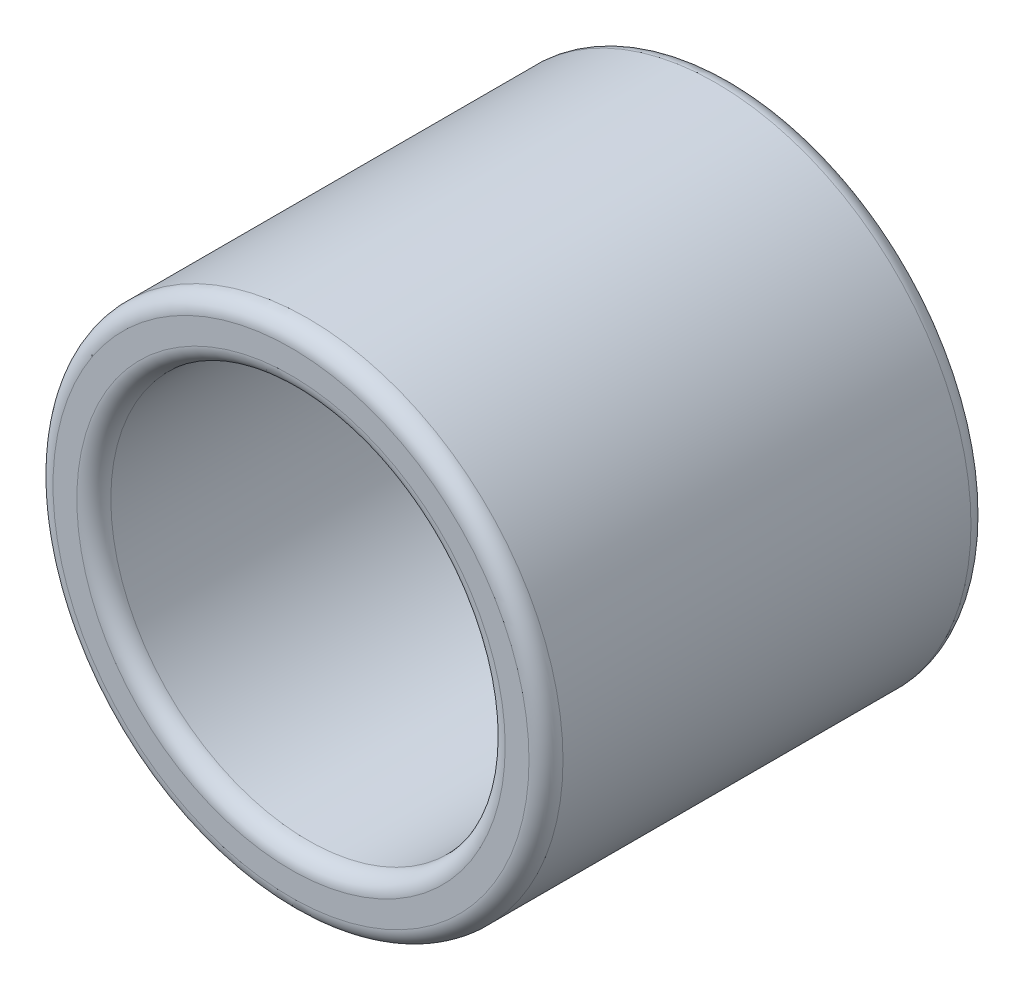
ISO-10303-21;
HEADER;
FILE_DESCRIPTION(('STEP AP214'),'2;1');
FILE_NAME('part.step','',(''),(''),'','','');
FILE_SCHEMA(('AUTOMOTIVE_DESIGN { 1 0 10303 214 1 1 1 1 }'));
ENDSEC;
DATA;
#1=APPLICATION_CONTEXT('core data for automotive mechanical design processes');
#2=APPLICATION_PROTOCOL_DEFINITION('international standard','automotive_design',2000,#1);
#3=PRODUCT_CONTEXT('',#1,'mechanical');
#4=PRODUCT('Part','Part','',(#3));
#5=PRODUCT_RELATED_PRODUCT_CATEGORY('part','',(#4));
#6=PRODUCT_DEFINITION_FORMATION('','',#4);
#7=PRODUCT_DEFINITION_CONTEXT('part definition',#1,'design');
#8=PRODUCT_DEFINITION('design','',#6,#7);
#9=PRODUCT_DEFINITION_SHAPE('','',#8);
#10=(LENGTH_UNIT() NAMED_UNIT(*) SI_UNIT(.MILLI.,.METRE.));
#11=(NAMED_UNIT(*) PLANE_ANGLE_UNIT() SI_UNIT($,.RADIAN.));
#12=(NAMED_UNIT(*) SI_UNIT($,.STERADIAN.) SOLID_ANGLE_UNIT());
#13=UNCERTAINTY_MEASURE_WITH_UNIT(LENGTH_MEASURE(1.E-05),#10,'distance_accuracy_value','');
#14=(GEOMETRIC_REPRESENTATION_CONTEXT(3) GLOBAL_UNCERTAINTY_ASSIGNED_CONTEXT((#13)) GLOBAL_UNIT_ASSIGNED_CONTEXT((#10,
#11,#12)) REPRESENTATION_CONTEXT('',''));
#15=CARTESIAN_POINT('',(0.,0.,0.));
#16=DIRECTION('',(0.,0.,1.));
#17=DIRECTION('',(1.,0.,0.));
#18=AXIS2_PLACEMENT_3D('',#15,#16,#17);
#19=CARTESIAN_POINT('',(0.,0.,13.));
#20=DIRECTION('',(0.,0.,-1.));
#21=DIRECTION('',(-1.,0.,0.));
#22=AXIS2_PLACEMENT_3D('',#19,#20,#21);
#23=CYLINDRICAL_SURFACE('',#22,7.5);
#24=CARTESIAN_POINT('',(0.,0.,0.5));
#25=DIRECTION('',(0.,0.,1.));
#26=DIRECTION('',(1.,0.,0.));
#27=AXIS2_PLACEMENT_3D('',#24,#25,#26);
#28=CIRCLE('',#27,7.5);
#29=CARTESIAN_POINT('',(-7.5,0.,0.5));
#30=VERTEX_POINT('',#29);
#31=EDGE_CURVE('E67',#30,#30,#28,.T.);
#32=CARTESIAN_POINT('',(0.,0.,12.5));
#33=DIRECTION('',(0.,0.,1.));
#34=DIRECTION('',(1.,0.,0.));
#35=AXIS2_PLACEMENT_3D('',#32,#33,#34);
#36=CIRCLE('',#35,7.5);
#37=CARTESIAN_POINT('',(-7.5,0.,12.5));
#38=VERTEX_POINT('',#37);
#39=EDGE_CURVE('E70',#38,#38,#36,.F.);
#40=CARTESIAN_POINT('',(-7.5,0.,0.5));
#41=CARTESIAN_POINT('',(-7.5,0.,0.625000000000001));
#42=CARTESIAN_POINT('',(-7.5,0.,0.750000000000001));
#43=CARTESIAN_POINT('',(-7.5,0.,1.));
#44=CARTESIAN_POINT('',(-7.5,0.,1.125));
#45=CARTESIAN_POINT('',(-7.5,0.,1.375));
#46=CARTESIAN_POINT('',(-7.5,0.,1.5));
#47=CARTESIAN_POINT('',(-7.5,0.,1.75));
#48=CARTESIAN_POINT('',(-7.5,0.,1.875));
#49=CARTESIAN_POINT('',(-7.5,0.,2.125));
#50=CARTESIAN_POINT('',(-7.5,0.,2.25));
#51=CARTESIAN_POINT('',(-7.5,0.,2.5));
#52=CARTESIAN_POINT('',(-7.5,0.,2.625));
#53=CARTESIAN_POINT('',(-7.5,0.,2.875));
#54=CARTESIAN_POINT('',(-7.5,0.,3.));
#55=CARTESIAN_POINT('',(-7.5,0.,3.25));
#56=CARTESIAN_POINT('',(-7.5,0.,3.375));
#57=CARTESIAN_POINT('',(-7.5,0.,3.625));
#58=CARTESIAN_POINT('',(-7.5,0.,3.75));
#59=CARTESIAN_POINT('',(-7.5,0.,4.));
#60=CARTESIAN_POINT('',(-7.5,0.,4.125));
#61=CARTESIAN_POINT('',(-7.5,0.,4.375));
#62=CARTESIAN_POINT('',(-7.5,0.,4.5));
#63=CARTESIAN_POINT('',(-7.5,0.,4.75));
#64=CARTESIAN_POINT('',(-7.5,0.,4.875));
#65=CARTESIAN_POINT('',(-7.5,0.,5.125));
#66=CARTESIAN_POINT('',(-7.5,0.,5.25));
#67=CARTESIAN_POINT('',(-7.5,0.,5.5));
#68=CARTESIAN_POINT('',(-7.5,0.,5.625));
#69=CARTESIAN_POINT('',(-7.5,0.,5.875));
#70=CARTESIAN_POINT('',(-7.5,0.,6.));
#71=CARTESIAN_POINT('',(-7.5,0.,6.25));
#72=CARTESIAN_POINT('',(-7.5,0.,6.375));
#73=CARTESIAN_POINT('',(-7.5,0.,6.625));
#74=CARTESIAN_POINT('',(-7.5,0.,6.75));
#75=CARTESIAN_POINT('',(-7.5,0.,7.));
#76=CARTESIAN_POINT('',(-7.5,0.,7.125));
#77=CARTESIAN_POINT('',(-7.5,0.,7.375));
#78=CARTESIAN_POINT('',(-7.5,0.,7.5));
#79=CARTESIAN_POINT('',(-7.5,0.,7.75));
#80=CARTESIAN_POINT('',(-7.5,0.,7.875));
#81=CARTESIAN_POINT('',(-7.5,0.,8.125));
#82=CARTESIAN_POINT('',(-7.5,0.,8.25));
#83=CARTESIAN_POINT('',(-7.5,0.,8.5));
#84=CARTESIAN_POINT('',(-7.5,0.,8.625));
#85=CARTESIAN_POINT('',(-7.5,0.,8.875));
#86=CARTESIAN_POINT('',(-7.5,0.,9.));
#87=CARTESIAN_POINT('',(-7.5,0.,9.25));
#88=CARTESIAN_POINT('',(-7.5,0.,9.375));
#89=CARTESIAN_POINT('',(-7.5,0.,9.625));
#90=CARTESIAN_POINT('',(-7.5,0.,9.75));
#91=CARTESIAN_POINT('',(-7.5,0.,10.));
#92=CARTESIAN_POINT('',(-7.5,0.,10.125));
#93=CARTESIAN_POINT('',(-7.5,0.,10.375));
#94=CARTESIAN_POINT('',(-7.5,0.,10.5));
#95=CARTESIAN_POINT('',(-7.5,0.,10.75));
#96=CARTESIAN_POINT('',(-7.5,0.,10.875));
#97=CARTESIAN_POINT('',(-7.5,0.,11.125));
#98=CARTESIAN_POINT('',(-7.5,0.,11.25));
#99=CARTESIAN_POINT('',(-7.5,0.,11.5));
#100=CARTESIAN_POINT('',(-7.5,0.,11.625));
#101=CARTESIAN_POINT('',(-7.5,0.,11.875));
#102=CARTESIAN_POINT('',(-7.5,0.,12.));
#103=CARTESIAN_POINT('',(-7.5,0.,12.25));
#104=CARTESIAN_POINT('',(-7.5,0.,12.375));
#105=CARTESIAN_POINT('',(-7.5,0.,12.5));
#106=B_SPLINE_CURVE_WITH_KNOTS('',3,(#40,#41,#42,#43,#44,#45,#46,#47,#48,#49,#50,#51,#52,#53,
#54,#55,#56,#57,#58,#59,#60,#61,#62,#63,#64,#65,#66,#67,#68,#69,#70,#71,#72,#73,#74,#75,#76,#77,
#78,#79,#80,#81,#82,#83,#84,#85,#86,#87,#88,#89,#90,#91,#92,#93,#94,#95,#96,#97,#98,#99,#100,
#101,#102,#103,#104,#105),.UNSPECIFIED.,.F.,.F.,(4,2,2,2,2,2,2,2,2,2,2,2,2,2,2,2,2,2,2,2,2,2,2,
2,2,2,2,2,2,2,2,2,4),(0.,0.375,0.750000000000001,1.125,1.5,1.875,2.25,2.625,3.,3.375,3.75,4.125,
4.5,4.875,5.25,5.625,6.,6.375,6.75,7.125,7.5,7.875,8.25,8.625,9.,9.375,9.75,10.125,10.5,10.875,
11.25,11.625,12.),.UNSPECIFIED.);
#107=EDGE_CURVE('BSEAM41',#30,#38,#106,.T.);
#108=ORIENTED_EDGE('',*,*,#31,.T.);
#109=ORIENTED_EDGE('',*,*,#39,.T.);
#110=ORIENTED_EDGE('',*,*,#107,.T.);
#111=ORIENTED_EDGE('',*,*,#107,.F.);
#112=EDGE_LOOP('',(#108,#110,#109,#111));
#113=FACE_BOUND('',#112,.T.);
#114=ADVANCED_FACE('F41',(#113),#23,.T.);
#115=CARTESIAN_POINT('',(0.,0.,13.));
#116=DIRECTION('',(0.,0.,1.));
#117=DIRECTION('',(1.,0.,0.));
#118=AXIS2_PLACEMENT_3D('',#115,#116,#117);
#119=PLANE('',#118);
#120=CARTESIAN_POINT('',(0.,0.,13.));
#121=DIRECTION('',(0.,0.,1.));
#122=DIRECTION('',(1.,0.,0.));
#123=AXIS2_PLACEMENT_3D('',#120,#121,#122);
#124=CIRCLE('',#123,7.);
#125=CARTESIAN_POINT('',(7.,0.,13.));
#126=VERTEX_POINT('',#125);
#127=EDGE_CURVE('E56',#126,#126,#124,.T.);
#128=ORIENTED_EDGE('',*,*,#127,.T.);
#129=EDGE_LOOP('',(#128));
#130=FACE_BOUND('',#129,.T.);
#131=CARTESIAN_POINT('',(0.,0.,13.));
#132=DIRECTION('',(0.,0.,1.));
#133=DIRECTION('',(1.,0.,0.));
#134=AXIS2_PLACEMENT_3D('',#131,#132,#133);
#135=CIRCLE('',#134,6.3);
#136=CARTESIAN_POINT('',(6.3,0.,13.));
#137=VERTEX_POINT('',#136);
#138=EDGE_CURVE('E61',#137,#137,#135,.F.);
#139=ORIENTED_EDGE('',*,*,#138,.T.);
#140=EDGE_LOOP('',(#139));
#141=FACE_BOUND('',#140,.T.);
#142=ADVANCED_FACE('F83',(#130,#141),#119,.T.);
#143=CARTESIAN_POINT('',(0.,0.,0.));
#144=DIRECTION('',(0.,0.,1.));
#145=DIRECTION('',(1.,0.,0.));
#146=AXIS2_PLACEMENT_3D('',#143,#144,#145);
#147=PLANE('',#146);
#148=CARTESIAN_POINT('',(0.,0.,0.));
#149=DIRECTION('',(0.,0.,1.));
#150=DIRECTION('',(1.,0.,0.));
#151=AXIS2_PLACEMENT_3D('',#148,#149,#150);
#152=CIRCLE('',#151,7.);
#153=CARTESIAN_POINT('',(7.,0.,0.));
#154=VERTEX_POINT('',#153);
#155=EDGE_CURVE('E64',#154,#154,#152,.F.);
#156=ORIENTED_EDGE('',*,*,#155,.T.);
#157=EDGE_LOOP('',(#156));
#158=FACE_BOUND('',#157,.T.);
#159=ADVANCED_FACE('F86',(#158),#147,.F.);
#160=CARTESIAN_POINT('',(0.,0.,3.));
#161=DIRECTION('',(0.,0.,1.));
#162=DIRECTION('',(1.,0.,0.));
#163=AXIS2_PLACEMENT_3D('',#160,#161,#162);
#164=CYLINDRICAL_SURFACE('',#163,5.8);
#165=CARTESIAN_POINT('',(0.,0.,12.5));
#166=DIRECTION('',(0.,0.,1.));
#167=DIRECTION('',(1.,0.,0.));
#168=AXIS2_PLACEMENT_3D('',#165,#166,#167);
#169=CIRCLE('',#168,5.8);
#170=CARTESIAN_POINT('',(5.8,0.,12.5));
#171=VERTEX_POINT('',#170);
#172=EDGE_CURVE('E48',#171,#171,#169,.T.);
#173=ORIENTED_EDGE('',*,*,#172,.T.);
#174=EDGE_LOOP('',(#173));
#175=FACE_BOUND('',#174,.T.);
#176=CARTESIAN_POINT('',(0.,0.,3.5));
#177=DIRECTION('',(0.,0.,1.));
#178=DIRECTION('',(1.,0.,0.));
#179=AXIS2_PLACEMENT_3D('',#176,#177,#178);
#180=CIRCLE('',#179,5.8);
#181=CARTESIAN_POINT('',(5.8,0.,3.5));
#182=VERTEX_POINT('',#181);
#183=EDGE_CURVE('E52',#182,#182,#180,.F.);
#184=ORIENTED_EDGE('',*,*,#183,.T.);
#185=EDGE_LOOP('',(#184));
#186=FACE_BOUND('',#185,.T.);
#187=ADVANCED_FACE('F109',(#175,#186),#164,.F.);
#188=CARTESIAN_POINT('',(0.,0.,3.));
#189=DIRECTION('',(0.,0.,1.));
#190=DIRECTION('',(1.,0.,0.));
#191=AXIS2_PLACEMENT_3D('',#188,#189,#190);
#192=PLANE('',#191);
#193=CARTESIAN_POINT('',(0.,0.,3.));
#194=DIRECTION('',(0.,0.,1.));
#195=DIRECTION('',(1.,0.,0.));
#196=AXIS2_PLACEMENT_3D('',#193,#194,#195);
#197=CIRCLE('',#196,5.3);
#198=CARTESIAN_POINT('',(5.3,0.,3.));
#199=VERTEX_POINT('',#198);
#200=EDGE_CURVE('E10',#199,#199,#197,.T.);
#201=ORIENTED_EDGE('',*,*,#200,.T.);
#202=EDGE_LOOP('',(#201));
#203=FACE_BOUND('',#202,.T.);
#204=ADVANCED_FACE('F104',(#203),#192,.T.);
#205=CARTESIAN_POINT('',(0.,0.,0.5));
#206=DIRECTION('',(0.,0.,1.));
#207=DIRECTION('',(1.,0.,0.));
#208=AXIS2_PLACEMENT_3D('',#205,#206,#207);
#209=TOROIDAL_SURFACE('',#208,7.,0.5);
#210=ORIENTED_EDGE('',*,*,#155,.F.);
#211=EDGE_LOOP('',(#210));
#212=FACE_BOUND('',#211,.T.);
#213=ORIENTED_EDGE('',*,*,#31,.F.);
#214=EDGE_LOOP('',(#213));
#215=FACE_BOUND('',#214,.T.);
#216=ADVANCED_FACE('F79',(#212,#215),#209,.T.);
#217=CARTESIAN_POINT('',(0.,0.,12.5));
#218=DIRECTION('',(0.,0.,1.));
#219=DIRECTION('',(1.,0.,0.));
#220=AXIS2_PLACEMENT_3D('',#217,#218,#219);
#221=TOROIDAL_SURFACE('',#220,7.,0.5);
#222=ORIENTED_EDGE('',*,*,#39,.F.);
#223=EDGE_LOOP('',(#222));
#224=FACE_BOUND('',#223,.T.);
#225=ORIENTED_EDGE('',*,*,#127,.F.);
#226=EDGE_LOOP('',(#225));
#227=FACE_BOUND('',#226,.T.);
#228=ADVANCED_FACE('F75',(#224,#227),#221,.T.);
#229=CARTESIAN_POINT('',(0.,0.,12.5));
#230=DIRECTION('',(0.,0.,1.));
#231=DIRECTION('',(1.,0.,0.));
#232=AXIS2_PLACEMENT_3D('',#229,#230,#231);
#233=TOROIDAL_SURFACE('',#232,6.3,0.5);
#234=ORIENTED_EDGE('',*,*,#138,.F.);
#235=EDGE_LOOP('',(#234));
#236=FACE_BOUND('',#235,.T.);
#237=ORIENTED_EDGE('',*,*,#172,.F.);
#238=EDGE_LOOP('',(#237));
#239=FACE_BOUND('',#238,.T.);
#240=ADVANCED_FACE('F78',(#236,#239),#233,.T.);
#241=CARTESIAN_POINT('',(0.,0.,3.5));
#242=DIRECTION('',(0.,0.,1.));
#243=DIRECTION('',(1.,0.,0.));
#244=AXIS2_PLACEMENT_3D('',#241,#242,#243);
#245=TOROIDAL_SURFACE('',#244,5.3,0.5);
#246=ORIENTED_EDGE('',*,*,#183,.F.);
#247=EDGE_LOOP('',(#246));
#248=FACE_BOUND('',#247,.T.);
#249=ORIENTED_EDGE('',*,*,#200,.F.);
#250=EDGE_LOOP('',(#249));
#251=FACE_BOUND('',#250,.T.);
#252=ADVANCED_FACE('F43',(#248,#251),#245,.F.);
#253=CLOSED_SHELL('',(#114,#142,#159,#187,#204,#216,#228,#240,#252));
#254=MANIFOLD_SOLID_BREP('B2',#253);
#255=ADVANCED_BREP_SHAPE_REPRESENTATION('',(#18,#254),#14);
#256=SHAPE_DEFINITION_REPRESENTATION(#9,#255);
ENDSEC;
END-ISO-10303-21;
